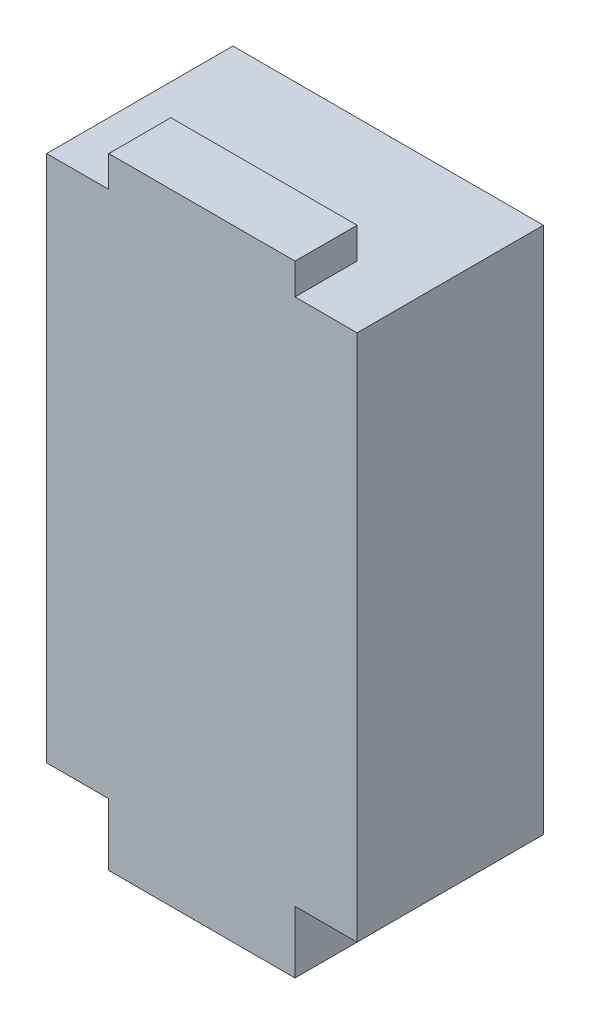
ISO-10303-21;
HEADER;
FILE_DESCRIPTION(('STEP AP214'),'2;1');
FILE_NAME('part.step','',(''),(''),'','','');
FILE_SCHEMA(('AUTOMOTIVE_DESIGN { 1 0 10303 214 1 1 1 1 }'));
ENDSEC;
DATA;
#1=APPLICATION_CONTEXT('core data for automotive mechanical design processes');
#2=APPLICATION_PROTOCOL_DEFINITION('international standard','automotive_design',2000,#1);
#3=PRODUCT_CONTEXT('',#1,'mechanical');
#4=PRODUCT('Part','Part','',(#3));
#5=PRODUCT_RELATED_PRODUCT_CATEGORY('part','',(#4));
#6=PRODUCT_DEFINITION_FORMATION('','',#4);
#7=PRODUCT_DEFINITION_CONTEXT('part definition',#1,'design');
#8=PRODUCT_DEFINITION('design','',#6,#7);
#9=PRODUCT_DEFINITION_SHAPE('','',#8);
#10=(LENGTH_UNIT() NAMED_UNIT(*) SI_UNIT(.MILLI.,.METRE.));
#11=(NAMED_UNIT(*) PLANE_ANGLE_UNIT() SI_UNIT($,.RADIAN.));
#12=(NAMED_UNIT(*) SI_UNIT($,.STERADIAN.) SOLID_ANGLE_UNIT());
#13=UNCERTAINTY_MEASURE_WITH_UNIT(LENGTH_MEASURE(1.E-05),#10,'distance_accuracy_value','');
#14=(GEOMETRIC_REPRESENTATION_CONTEXT(3) GLOBAL_UNCERTAINTY_ASSIGNED_CONTEXT((#13)) GLOBAL_UNIT_ASSIGNED_CONTEXT((#10,
#11,#12)) REPRESENTATION_CONTEXT('',''));
#15=CARTESIAN_POINT('',(0.,0.,0.));
#16=DIRECTION('',(0.,0.,1.));
#17=DIRECTION('',(1.,0.,0.));
#18=AXIS2_PLACEMENT_3D('',#15,#16,#17);
#19=CARTESIAN_POINT('',(0.,0.,0.));
#20=DIRECTION('',(0.,0.,-1.));
#21=DIRECTION('',(-1.,0.,0.));
#22=AXIS2_PLACEMENT_3D('',#19,#20,#21);
#23=PLANE('',#22);
#24=DIRECTION('',(-1.,0.,0.));
#25=VECTOR('',#24,1.);
#26=CARTESIAN_POINT('',(-50.,10.,0.));
#27=LINE('',#26,#25);
#28=CARTESIAN_POINT('',(-10.,10.,0.));
#29=VERTEX_POINT('',#28);
#30=CARTESIAN_POINT('',(-40.,10.,0.));
#31=VERTEX_POINT('',#30);
#32=EDGE_CURVE('E11',#29,#31,#27,.T.);
#33=ORIENTED_EDGE('',*,*,#32,.F.);
#34=DIRECTION('',(0.,1.,0.));
#35=VECTOR('',#34,1.);
#36=CARTESIAN_POINT('',(-10.,0.,0.));
#37=LINE('',#36,#35);
#38=CARTESIAN_POINT('',(-10.,0.,0.));
#39=VERTEX_POINT('',#38);
#40=EDGE_CURVE('E155',#39,#29,#37,.T.);
#41=ORIENTED_EDGE('',*,*,#40,.F.);
#42=DIRECTION('',(1.,0.,0.));
#43=VECTOR('',#42,1.);
#44=CARTESIAN_POINT('',(-10.,0.,0.));
#45=LINE('',#44,#43);
#46=CARTESIAN_POINT('',(-40.,0.,0.));
#47=VERTEX_POINT('',#46);
#48=EDGE_CURVE('E152',#47,#39,#45,.T.);
#49=ORIENTED_EDGE('',*,*,#48,.F.);
#50=DIRECTION('',(0.,-1.,0.));
#51=VECTOR('',#50,1.);
#52=CARTESIAN_POINT('',(-40.,0.,0.));
#53=LINE('',#52,#51);
#54=EDGE_CURVE('E149',#31,#47,#53,.T.);
#55=ORIENTED_EDGE('',*,*,#54,.F.);
#56=EDGE_LOOP('',(#33,#41,#49,#55));
#57=FACE_BOUND('',#56,.T.);
#58=ADVANCED_FACE('F33',(#57),#23,.T.);
#59=CARTESIAN_POINT('',(-40.,0.,10.));
#60=DIRECTION('',(1.,0.,0.));
#61=DIRECTION('',(0.,0.,-1.));
#62=AXIS2_PLACEMENT_3D('',#59,#60,#61);
#63=PLANE('',#62);
#64=ORIENTED_EDGE('',*,*,#54,.T.);
#65=DIRECTION('',(0.,0.,-1.));
#66=VECTOR('',#65,1.);
#67=CARTESIAN_POINT('',(-40.,0.,10.));
#68=LINE('',#67,#66);
#69=CARTESIAN_POINT('',(-40.,0.,10.));
#70=VERTEX_POINT('',#69);
#71=EDGE_CURVE('E37',#70,#47,#68,.T.);
#72=ORIENTED_EDGE('',*,*,#71,.F.);
#73=DIRECTION('',(0.,-1.,0.));
#74=VECTOR('',#73,1.);
#75=CARTESIAN_POINT('',(-40.,0.,10.));
#76=LINE('',#75,#74);
#77=CARTESIAN_POINT('',(-40.,9.99999999999999,10.));
#78=VERTEX_POINT('',#77);
#79=EDGE_CURVE('E163',#78,#70,#76,.T.);
#80=ORIENTED_EDGE('',*,*,#79,.F.);
#81=DIRECTION('',(0.,0.,-1.));
#82=VECTOR('',#81,1.);
#83=CARTESIAN_POINT('',(-40.,9.99999999999999,10.));
#84=LINE('',#83,#82);
#85=EDGE_CURVE('E145',#78,#31,#84,.T.);
#86=ORIENTED_EDGE('',*,*,#85,.T.);
#87=EDGE_LOOP('',(#64,#72,#80,#86));
#88=FACE_BOUND('',#87,.T.);
#89=ADVANCED_FACE('F35',(#88),#63,.F.);
#90=CARTESIAN_POINT('',(-10.,0.,10.));
#91=DIRECTION('',(0.,1.,0.));
#92=DIRECTION('',(-1.,0.,0.));
#93=AXIS2_PLACEMENT_3D('',#90,#91,#92);
#94=PLANE('',#93);
#95=ORIENTED_EDGE('',*,*,#48,.T.);
#96=DIRECTION('',(0.,0.,-1.));
#97=VECTOR('',#96,1.);
#98=CARTESIAN_POINT('',(-10.,0.,10.));
#99=LINE('',#98,#97);
#100=CARTESIAN_POINT('',(-10.,0.,10.));
#101=VERTEX_POINT('',#100);
#102=EDGE_CURVE('E181',#101,#39,#99,.T.);
#103=ORIENTED_EDGE('',*,*,#102,.F.);
#104=DIRECTION('',(1.,0.,0.));
#105=VECTOR('',#104,1.);
#106=CARTESIAN_POINT('',(-10.,0.,10.));
#107=LINE('',#106,#105);
#108=EDGE_CURVE('E89',#70,#101,#107,.T.);
#109=ORIENTED_EDGE('',*,*,#108,.F.);
#110=ORIENTED_EDGE('',*,*,#71,.T.);
#111=EDGE_LOOP('',(#95,#103,#109,#110));
#112=FACE_BOUND('',#111,.T.);
#113=ADVANCED_FACE('F270',(#112),#94,.F.);
#114=CARTESIAN_POINT('',(-10.,0.,10.));
#115=DIRECTION('',(-1.,0.,0.));
#116=DIRECTION('',(0.,0.,1.));
#117=AXIS2_PLACEMENT_3D('',#114,#115,#116);
#118=PLANE('',#117);
#119=ORIENTED_EDGE('',*,*,#40,.T.);
#120=DIRECTION('',(0.,0.,-1.));
#121=VECTOR('',#120,1.);
#122=CARTESIAN_POINT('',(-10.,10.,10.));
#123=LINE('',#122,#121);
#124=CARTESIAN_POINT('',(-10.,10.,10.));
#125=VERTEX_POINT('',#124);
#126=EDGE_CURVE('E179',#125,#29,#123,.T.);
#127=ORIENTED_EDGE('',*,*,#126,.F.);
#128=DIRECTION('',(0.,1.,0.));
#129=VECTOR('',#128,1.);
#130=CARTESIAN_POINT('',(-10.,0.,10.));
#131=LINE('',#130,#129);
#132=EDGE_CURVE('E195',#101,#125,#131,.T.);
#133=ORIENTED_EDGE('',*,*,#132,.F.);
#134=ORIENTED_EDGE('',*,*,#102,.T.);
#135=EDGE_LOOP('',(#119,#127,#133,#134));
#136=FACE_BOUND('',#135,.T.);
#137=ADVANCED_FACE('F289',(#136),#118,.F.);
#138=CARTESIAN_POINT('',(0.,10.,10.));
#139=DIRECTION('',(-1.,0.,0.));
#140=DIRECTION('',(0.,-1.,0.));
#141=AXIS2_PLACEMENT_3D('',#138,#139,#140);
#142=PLANE('',#141);
#143=DIRECTION('',(0.,0.,-1.));
#144=VECTOR('',#143,1.);
#145=CARTESIAN_POINT('',(0.,10.,10.));
#146=LINE('',#145,#144);
#147=CARTESIAN_POINT('',(0.,10.,10.));
#148=VERTEX_POINT('',#147);
#149=CARTESIAN_POINT('',(0.,10.,-20.));
#150=VERTEX_POINT('',#149);
#151=EDGE_CURVE('E176',#148,#150,#146,.T.);
#152=ORIENTED_EDGE('',*,*,#151,.T.);
#153=DIRECTION('',(0.,-1.,0.));
#154=VECTOR('',#153,1.);
#155=CARTESIAN_POINT('',(0.,95.,-20.));
#156=LINE('',#155,#154);
#157=CARTESIAN_POINT('',(0.,95.,-20.));
#158=VERTEX_POINT('',#157);
#159=EDGE_CURVE('E234',#158,#150,#156,.T.);
#160=ORIENTED_EDGE('',*,*,#159,.F.);
#161=DIRECTION('',(0.,0.,-1.));
#162=VECTOR('',#161,1.);
#163=CARTESIAN_POINT('',(0.,95.,10.));
#164=LINE('',#163,#162);
#165=CARTESIAN_POINT('',(0.,95.,10.));
#166=VERTEX_POINT('',#165);
#167=EDGE_CURVE('E174',#166,#158,#164,.T.);
#168=ORIENTED_EDGE('',*,*,#167,.F.);
#169=DIRECTION('',(0.,1.,0.));
#170=VECTOR('',#169,1.);
#171=CARTESIAN_POINT('',(0.,10.,10.));
#172=LINE('',#171,#170);
#173=EDGE_CURVE('E199',#148,#166,#172,.T.);
#174=ORIENTED_EDGE('',*,*,#173,.F.);
#175=EDGE_LOOP('',(#152,#160,#168,#174));
#176=FACE_BOUND('',#175,.T.);
#177=ADVANCED_FACE('F238',(#176),#142,.F.);
#178=CARTESIAN_POINT('',(-10.,100.,10.));
#179=DIRECTION('',(-1.,0.,0.));
#180=DIRECTION('',(0.,0.,1.));
#181=AXIS2_PLACEMENT_3D('',#178,#179,#180);
#182=PLANE('',#181);
#183=DIRECTION('',(0.,1.,0.));
#184=VECTOR('',#183,1.);
#185=CARTESIAN_POINT('',(-10.,100.,0.));
#186=LINE('',#185,#184);
#187=CARTESIAN_POINT('',(-10.,95.,0.));
#188=VERTEX_POINT('',#187);
#189=CARTESIAN_POINT('',(-10.,100.,0.));
#190=VERTEX_POINT('',#189);
#191=EDGE_CURVE('E73',#188,#190,#186,.T.);
#192=ORIENTED_EDGE('',*,*,#191,.T.);
#193=DIRECTION('',(0.,0.,-1.));
#194=VECTOR('',#193,1.);
#195=CARTESIAN_POINT('',(-10.,100.,10.));
#196=LINE('',#195,#194);
#197=CARTESIAN_POINT('',(-10.,100.,10.));
#198=VERTEX_POINT('',#197);
#199=EDGE_CURVE('E170',#198,#190,#196,.T.);
#200=ORIENTED_EDGE('',*,*,#199,.F.);
#201=DIRECTION('',(0.,1.,0.));
#202=VECTOR('',#201,1.);
#203=CARTESIAN_POINT('',(-10.,100.,10.));
#204=LINE('',#203,#202);
#205=CARTESIAN_POINT('',(-10.,95.,10.));
#206=VERTEX_POINT('',#205);
#207=EDGE_CURVE('E203',#206,#198,#204,.T.);
#208=ORIENTED_EDGE('',*,*,#207,.F.);
#209=DIRECTION('',(0.,0.,-1.));
#210=VECTOR('',#209,1.);
#211=CARTESIAN_POINT('',(-10.,95.,10.));
#212=LINE('',#211,#210);
#213=EDGE_CURVE('E172',#206,#188,#212,.T.);
#214=ORIENTED_EDGE('',*,*,#213,.T.);
#215=EDGE_LOOP('',(#192,#200,#208,#214));
#216=FACE_BOUND('',#215,.T.);
#217=ADVANCED_FACE('F284',(#216),#182,.F.);
#218=CARTESIAN_POINT('',(-10.,100.,10.));
#219=DIRECTION('',(0.,-1.,0.));
#220=DIRECTION('',(0.,0.,-1.));
#221=AXIS2_PLACEMENT_3D('',#218,#219,#220);
#222=PLANE('',#221);
#223=DIRECTION('',(-1.,0.,0.));
#224=VECTOR('',#223,1.);
#225=CARTESIAN_POINT('',(-10.,100.,0.));
#226=LINE('',#225,#224);
#227=CARTESIAN_POINT('',(-40.,100.,0.));
#228=VERTEX_POINT('',#227);
#229=EDGE_CURVE('E80',#190,#228,#226,.T.);
#230=ORIENTED_EDGE('',*,*,#229,.T.);
#231=DIRECTION('',(0.,0.,-1.));
#232=VECTOR('',#231,1.);
#233=CARTESIAN_POINT('',(-40.,100.,10.));
#234=LINE('',#233,#232);
#235=CARTESIAN_POINT('',(-40.,100.,10.));
#236=VERTEX_POINT('',#235);
#237=EDGE_CURVE('E168',#236,#228,#234,.T.);
#238=ORIENTED_EDGE('',*,*,#237,.F.);
#239=DIRECTION('',(-1.,0.,0.));
#240=VECTOR('',#239,1.);
#241=CARTESIAN_POINT('',(-10.,100.,10.));
#242=LINE('',#241,#240);
#243=EDGE_CURVE('E205',#198,#236,#242,.T.);
#244=ORIENTED_EDGE('',*,*,#243,.F.);
#245=ORIENTED_EDGE('',*,*,#199,.T.);
#246=EDGE_LOOP('',(#230,#238,#244,#245));
#247=FACE_BOUND('',#246,.T.);
#248=ADVANCED_FACE('F208',(#247),#222,.F.);
#249=CARTESIAN_POINT('',(-40.,100.,10.));
#250=DIRECTION('',(1.,0.,0.));
#251=DIRECTION('',(0.,0.,-1.));
#252=AXIS2_PLACEMENT_3D('',#249,#250,#251);
#253=PLANE('',#252);
#254=DIRECTION('',(0.,-1.,0.));
#255=VECTOR('',#254,1.);
#256=CARTESIAN_POINT('',(-40.,100.,0.));
#257=LINE('',#256,#255);
#258=CARTESIAN_POINT('',(-40.,95.,0.));
#259=VERTEX_POINT('',#258);
#260=EDGE_CURVE('E160',#228,#259,#257,.T.);
#261=ORIENTED_EDGE('',*,*,#260,.T.);
#262=DIRECTION('',(0.,0.,-1.));
#263=VECTOR('',#262,1.);
#264=CARTESIAN_POINT('',(-40.,95.,10.));
#265=LINE('',#264,#263);
#266=CARTESIAN_POINT('',(-40.,95.,10.));
#267=VERTEX_POINT('',#266);
#268=EDGE_CURVE('E139',#267,#259,#265,.T.);
#269=ORIENTED_EDGE('',*,*,#268,.F.);
#270=DIRECTION('',(0.,-1.,0.));
#271=VECTOR('',#270,1.);
#272=CARTESIAN_POINT('',(-40.,100.,10.));
#273=LINE('',#272,#271);
#274=EDGE_CURVE('E123',#236,#267,#273,.T.);
#275=ORIENTED_EDGE('',*,*,#274,.F.);
#276=ORIENTED_EDGE('',*,*,#237,.T.);
#277=EDGE_LOOP('',(#261,#269,#275,#276));
#278=FACE_BOUND('',#277,.T.);
#279=ADVANCED_FACE('F211',(#278),#253,.F.);
#280=CARTESIAN_POINT('',(-50.,95.,10.));
#281=DIRECTION('',(0.,-1.,0.));
#282=DIRECTION('',(0.,0.,-1.));
#283=AXIS2_PLACEMENT_3D('',#280,#281,#282);
#284=PLANE('',#283);
#285=ORIENTED_EDGE('',*,*,#268,.T.);
#286=DIRECTION('',(1.,0.,0.));
#287=VECTOR('',#286,1.);
#288=CARTESIAN_POINT('',(-50.,95.,0.));
#289=LINE('',#288,#287);
#290=EDGE_CURVE('E43',#259,#188,#289,.T.);
#291=ORIENTED_EDGE('',*,*,#290,.T.);
#292=ORIENTED_EDGE('',*,*,#213,.F.);
#293=DIRECTION('',(-1.,0.,0.));
#294=VECTOR('',#293,1.);
#295=CARTESIAN_POINT('',(0.,95.,10.));
#296=LINE('',#295,#294);
#297=EDGE_CURVE('E201',#166,#206,#296,.T.);
#298=ORIENTED_EDGE('',*,*,#297,.F.);
#299=ORIENTED_EDGE('',*,*,#167,.T.);
#300=DIRECTION('',(1.,0.,0.));
#301=VECTOR('',#300,1.);
#302=CARTESIAN_POINT('',(-50.,95.,-20.));
#303=LINE('',#302,#301);
#304=CARTESIAN_POINT('',(-50.,95.,-20.));
#305=VERTEX_POINT('',#304);
#306=EDGE_CURVE('E135',#305,#158,#303,.T.);
#307=ORIENTED_EDGE('',*,*,#306,.F.);
#308=DIRECTION('',(0.,0.,-1.));
#309=VECTOR('',#308,1.);
#310=CARTESIAN_POINT('',(-50.,95.,10.));
#311=LINE('',#310,#309);
#312=CARTESIAN_POINT('',(-50.,95.,10.));
#313=VERTEX_POINT('',#312);
#314=EDGE_CURVE('E130',#313,#305,#311,.T.);
#315=ORIENTED_EDGE('',*,*,#314,.F.);
#316=DIRECTION('',(-1.,0.,0.));
#317=VECTOR('',#316,1.);
#318=CARTESIAN_POINT('',(-50.,95.,10.));
#319=LINE('',#318,#317);
#320=EDGE_CURVE('E116',#267,#313,#319,.T.);
#321=ORIENTED_EDGE('',*,*,#320,.F.);
#322=EDGE_LOOP('',(#285,#291,#292,#298,#299,#307,#315,#321));
#323=FACE_BOUND('',#322,.T.);
#324=ADVANCED_FACE('F131',(#323),#284,.F.);
#325=CARTESIAN_POINT('',(-50.,9.99999999999999,10.));
#326=DIRECTION('',(1.,0.,0.));
#327=DIRECTION('',(0.,1.,0.));
#328=AXIS2_PLACEMENT_3D('',#325,#326,#327);
#329=PLANE('',#328);
#330=ORIENTED_EDGE('',*,*,#314,.T.);
#331=DIRECTION('',(0.,1.,0.));
#332=VECTOR('',#331,1.);
#333=CARTESIAN_POINT('',(-50.,95.,-20.));
#334=LINE('',#333,#332);
#335=CARTESIAN_POINT('',(-50.,10.,-20.));
#336=VERTEX_POINT('',#335);
#337=EDGE_CURVE('E236',#336,#305,#334,.T.);
#338=ORIENTED_EDGE('',*,*,#337,.F.);
#339=DIRECTION('',(0.,0.,-1.));
#340=VECTOR('',#339,1.);
#341=CARTESIAN_POINT('',(-50.,9.99999999999999,10.));
#342=LINE('',#341,#340);
#343=CARTESIAN_POINT('',(-50.,9.99999999999999,10.));
#344=VERTEX_POINT('',#343);
#345=EDGE_CURVE('E140',#344,#336,#342,.T.);
#346=ORIENTED_EDGE('',*,*,#345,.F.);
#347=DIRECTION('',(0.,-1.,0.));
#348=VECTOR('',#347,1.);
#349=CARTESIAN_POINT('',(-50.,9.99999999999999,10.));
#350=LINE('',#349,#348);
#351=EDGE_CURVE('E120',#313,#344,#350,.T.);
#352=ORIENTED_EDGE('',*,*,#351,.F.);
#353=EDGE_LOOP('',(#330,#338,#346,#352));
#354=FACE_BOUND('',#353,.T.);
#355=ADVANCED_FACE('F142',(#354),#329,.F.);
#356=CARTESIAN_POINT('',(-50.,9.99999999999999,10.));
#357=DIRECTION('',(0.,1.,0.));
#358=DIRECTION('',(0.,0.,1.));
#359=AXIS2_PLACEMENT_3D('',#356,#357,#358);
#360=PLANE('',#359);
#361=ORIENTED_EDGE('',*,*,#345,.T.);
#362=DIRECTION('',(-1.,0.,0.));
#363=VECTOR('',#362,1.);
#364=CARTESIAN_POINT('',(-50.,10.,-20.));
#365=LINE('',#364,#363);
#366=EDGE_CURVE('E153',#150,#336,#365,.T.);
#367=ORIENTED_EDGE('',*,*,#366,.F.);
#368=ORIENTED_EDGE('',*,*,#151,.F.);
#369=DIRECTION('',(1.,0.,0.));
#370=VECTOR('',#369,1.);
#371=CARTESIAN_POINT('',(0.,10.,10.));
#372=LINE('',#371,#370);
#373=EDGE_CURVE('E197',#125,#148,#372,.T.);
#374=ORIENTED_EDGE('',*,*,#373,.F.);
#375=ORIENTED_EDGE('',*,*,#126,.T.);
#376=ORIENTED_EDGE('',*,*,#32,.T.);
#377=ORIENTED_EDGE('',*,*,#85,.F.);
#378=DIRECTION('',(1.,0.,0.));
#379=VECTOR('',#378,1.);
#380=CARTESIAN_POINT('',(-50.,9.99999999999999,10.));
#381=LINE('',#380,#379);
#382=EDGE_CURVE('E52',#344,#78,#381,.T.);
#383=ORIENTED_EDGE('',*,*,#382,.F.);
#384=EDGE_LOOP('',(#361,#367,#368,#374,#375,#376,#377,#383));
#385=FACE_BOUND('',#384,.T.);
#386=ADVANCED_FACE('F273',(#385),#360,.F.);
#387=CARTESIAN_POINT('',(0.,0.,10.));
#388=DIRECTION('',(0.,0.,-1.));
#389=DIRECTION('',(-1.,0.,0.));
#390=AXIS2_PLACEMENT_3D('',#387,#388,#389);
#391=PLANE('',#390);
#392=ORIENTED_EDGE('',*,*,#79,.T.);
#393=ORIENTED_EDGE('',*,*,#108,.T.);
#394=ORIENTED_EDGE('',*,*,#132,.T.);
#395=ORIENTED_EDGE('',*,*,#373,.T.);
#396=ORIENTED_EDGE('',*,*,#173,.T.);
#397=ORIENTED_EDGE('',*,*,#297,.T.);
#398=ORIENTED_EDGE('',*,*,#207,.T.);
#399=ORIENTED_EDGE('',*,*,#243,.T.);
#400=ORIENTED_EDGE('',*,*,#274,.T.);
#401=ORIENTED_EDGE('',*,*,#320,.T.);
#402=ORIENTED_EDGE('',*,*,#351,.T.);
#403=ORIENTED_EDGE('',*,*,#382,.T.);
#404=EDGE_LOOP('',(#392,#393,#394,#395,#396,#397,#398,#399,#400,#401,#402,#403));
#405=FACE_BOUND('',#404,.T.);
#406=ADVANCED_FACE('F118',(#405),#391,.F.);
#407=ORIENTED_EDGE('',*,*,#290,.F.);
#408=ORIENTED_EDGE('',*,*,#260,.F.);
#409=ORIENTED_EDGE('',*,*,#229,.F.);
#410=ORIENTED_EDGE('',*,*,#191,.F.);
#411=EDGE_LOOP('',(#407,#408,#409,#410));
#412=FACE_BOUND('',#411,.T.);
#413=ADVANCED_FACE('F258',(#412),#23,.T.);
#414=CARTESIAN_POINT('',(0.,0.,-20.));
#415=DIRECTION('',(0.,0.,1.));
#416=DIRECTION('',(1.,0.,0.));
#417=AXIS2_PLACEMENT_3D('',#414,#415,#416);
#418=PLANE('',#417);
#419=CARTESIAN_POINT('',(-25.,35.,-20.));
#420=DIRECTION('',(0.,0.,-1.));
#421=DIRECTION('',(-1.,0.,0.));
#422=AXIS2_PLACEMENT_3D('',#419,#420,#421);
#423=CIRCLE('',#422,6.);
#424=CARTESIAN_POINT('',(-31.,35.,-20.));
#425=VERTEX_POINT('',#424);
#426=EDGE_CURVE('E243',#425,#425,#423,.T.);
#427=ORIENTED_EDGE('',*,*,#426,.F.);
#428=EDGE_LOOP('',(#427));
#429=FACE_BOUND('',#428,.T.);
#430=ORIENTED_EDGE('',*,*,#337,.T.);
#431=ORIENTED_EDGE('',*,*,#306,.T.);
#432=ORIENTED_EDGE('',*,*,#159,.T.);
#433=ORIENTED_EDGE('',*,*,#366,.T.);
#434=EDGE_LOOP('',(#430,#431,#432,#433));
#435=FACE_BOUND('',#434,.T.);
#436=ADVANCED_FACE('F232',(#429,#435),#418,.F.);
#437=CARTESIAN_POINT('',(-25.,35.,0.));
#438=DIRECTION('',(0.,0.,-1.));
#439=DIRECTION('',(-1.,0.,0.));
#440=AXIS2_PLACEMENT_3D('',#437,#438,#439);
#441=CYLINDRICAL_SURFACE('',#440,6.);
#442=CARTESIAN_POINT('',(-25.,35.,0.));
#443=DIRECTION('',(0.,0.,-1.));
#444=DIRECTION('',(-1.,0.,0.));
#445=AXIS2_PLACEMENT_3D('',#442,#443,#444);
#446=CIRCLE('',#445,6.);
#447=CARTESIAN_POINT('',(-31.,35.,0.));
#448=VERTEX_POINT('',#447);
#449=EDGE_CURVE('E242',#448,#448,#446,.T.);
#450=ORIENTED_EDGE('',*,*,#449,.F.);
#451=EDGE_LOOP('',(#450));
#452=FACE_BOUND('',#451,.T.);
#453=ORIENTED_EDGE('',*,*,#426,.T.);
#454=EDGE_LOOP('',(#453));
#455=FACE_BOUND('',#454,.T.);
#456=ADVANCED_FACE('F251',(#452,#455),#441,.F.);
#457=CARTESIAN_POINT('',(-25.,35.,0.));
#458=DIRECTION('',(0.,0.,-1.));
#459=DIRECTION('',(-1.,0.,0.));
#460=AXIS2_PLACEMENT_3D('',#457,#458,#459);
#461=PLANE('',#460);
#462=ORIENTED_EDGE('',*,*,#449,.T.);
#463=EDGE_LOOP('',(#462));
#464=FACE_BOUND('',#463,.T.);
#465=ADVANCED_FACE('F249',(#464),#461,.T.);
#466=CLOSED_SHELL('',(#58,#89,#113,#137,#177,#217,#248,#279,#324,#355,#386,#406,#413,#436,#456,#465));
#467=MANIFOLD_SOLID_BREP('B2',#466);
#468=ADVANCED_BREP_SHAPE_REPRESENTATION('',(#18,#467),#14);
#469=SHAPE_DEFINITION_REPRESENTATION(#9,#468);
ENDSEC;
END-ISO-10303-21;
